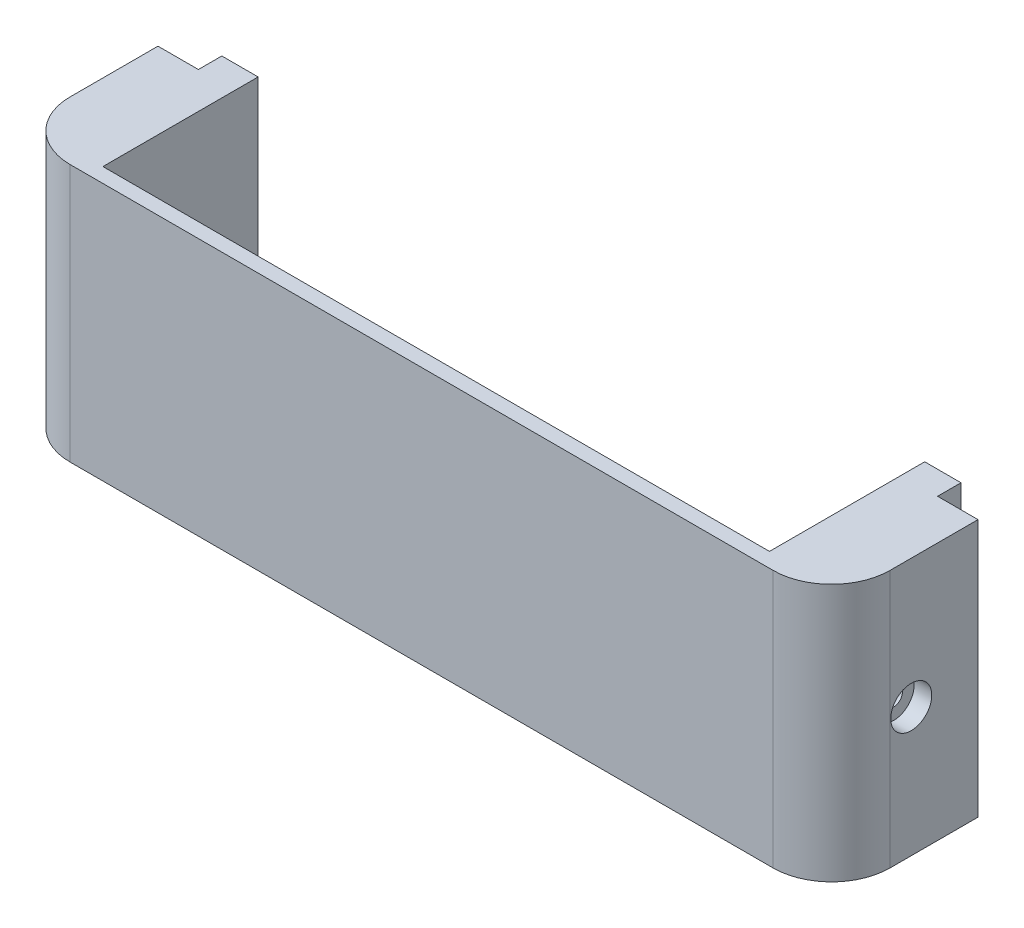
ISO-10303-21;
HEADER;
FILE_DESCRIPTION(('STEP AP214'),'2;1');
FILE_NAME('part.step','',(''),(''),'','','');
FILE_SCHEMA(('AUTOMOTIVE_DESIGN { 1 0 10303 214 1 1 1 1 }'));
ENDSEC;
DATA;
#1=APPLICATION_CONTEXT('core data for automotive mechanical design processes');
#2=APPLICATION_PROTOCOL_DEFINITION('international standard','automotive_design',2000,#1);
#3=PRODUCT_CONTEXT('',#1,'mechanical');
#4=PRODUCT('Part','Part','',(#3));
#5=PRODUCT_RELATED_PRODUCT_CATEGORY('part','',(#4));
#6=PRODUCT_DEFINITION_FORMATION('','',#4);
#7=PRODUCT_DEFINITION_CONTEXT('part definition',#1,'design');
#8=PRODUCT_DEFINITION('design','',#6,#7);
#9=PRODUCT_DEFINITION_SHAPE('','',#8);
#10=(LENGTH_UNIT() NAMED_UNIT(*) SI_UNIT(.MILLI.,.METRE.));
#11=(NAMED_UNIT(*) PLANE_ANGLE_UNIT() SI_UNIT($,.RADIAN.));
#12=(NAMED_UNIT(*) SI_UNIT($,.STERADIAN.) SOLID_ANGLE_UNIT());
#13=UNCERTAINTY_MEASURE_WITH_UNIT(LENGTH_MEASURE(1.E-05),#10,'distance_accuracy_value','');
#14=(GEOMETRIC_REPRESENTATION_CONTEXT(3) GLOBAL_UNCERTAINTY_ASSIGNED_CONTEXT((#13)) GLOBAL_UNIT_ASSIGNED_CONTEXT((#10,
#11,#12)) REPRESENTATION_CONTEXT('',''));
#15=CARTESIAN_POINT('',(0.,0.,0.));
#16=DIRECTION('',(0.,0.,1.));
#17=DIRECTION('',(1.,0.,0.));
#18=AXIS2_PLACEMENT_3D('',#15,#16,#17);
#19=CARTESIAN_POINT('',(15.,-22.,14.));
#20=DIRECTION('',(0.,-1.,0.));
#21=DIRECTION('',(1.,0.,0.));
#22=AXIS2_PLACEMENT_3D('',#19,#20,#21);
#23=PLANE('',#22);
#24=DIRECTION('',(0.,0.,-1.));
#25=VECTOR('',#24,1.);
#26=CARTESIAN_POINT('',(3.1,-22.,0.));
#27=LINE('',#26,#25);
#28=CARTESIAN_POINT('',(3.1,-22.,26.5));
#29=VERTEX_POINT('',#28);
#30=CARTESIAN_POINT('',(3.1,-22.,0.));
#31=VERTEX_POINT('',#30);
#32=EDGE_CURVE('E116',#29,#31,#27,.T.);
#33=ORIENTED_EDGE('',*,*,#32,.F.);
#34=DIRECTION('',(1.,0.,0.));
#35=VECTOR('',#34,1.);
#36=CARTESIAN_POINT('',(10.,-22.,26.5));
#37=LINE('',#36,#35);
#38=CARTESIAN_POINT('',(116.9,-22.,26.5));
#39=VERTEX_POINT('',#38);
#40=EDGE_CURVE('E217',#29,#39,#37,.T.);
#41=ORIENTED_EDGE('',*,*,#40,.T.);
#42=DIRECTION('',(0.,0.,-1.));
#43=VECTOR('',#42,1.);
#44=CARTESIAN_POINT('',(116.9,-22.,4.));
#45=LINE('',#44,#43);
#46=CARTESIAN_POINT('',(116.9,-22.,0.));
#47=VERTEX_POINT('',#46);
#48=EDGE_CURVE('E268',#39,#47,#45,.T.);
#49=ORIENTED_EDGE('',*,*,#48,.T.);
#50=DIRECTION('',(1.,0.,0.));
#51=VECTOR('',#50,1.);
#52=CARTESIAN_POINT('',(116.9,-22.,0.));
#53=LINE('',#52,#51);
#54=CARTESIAN_POINT('',(123.1,-22.,0.));
#55=VERTEX_POINT('',#54);
#56=EDGE_CURVE('E265',#47,#55,#53,.T.);
#57=ORIENTED_EDGE('',*,*,#56,.T.);
#58=DIRECTION('',(0.,0.,1.));
#59=VECTOR('',#58,1.);
#60=CARTESIAN_POINT('',(123.1,-22.,0.));
#61=LINE('',#60,#59);
#62=CARTESIAN_POINT('',(123.1,-22.,4.));
#63=VERTEX_POINT('',#62);
#64=EDGE_CURVE('E261',#55,#63,#61,.T.);
#65=ORIENTED_EDGE('',*,*,#64,.T.);
#66=DIRECTION('',(1.,0.,0.));
#67=VECTOR('',#66,1.);
#68=CARTESIAN_POINT('',(123.1,-22.,4.));
#69=LINE('',#68,#67);
#70=CARTESIAN_POINT('',(130.,-22.,4.));
#71=VERTEX_POINT('',#70);
#72=EDGE_CURVE('E257',#63,#71,#69,.T.);
#73=ORIENTED_EDGE('',*,*,#72,.T.);
#74=DIRECTION('',(0.,0.,-1.));
#75=VECTOR('',#74,1.);
#76=CARTESIAN_POINT('',(130.,-22.,19.));
#77=LINE('',#76,#75);
#78=CARTESIAN_POINT('',(130.,-22.,19.));
#79=VERTEX_POINT('',#78);
#80=EDGE_CURVE('E225',#79,#71,#77,.T.);
#81=ORIENTED_EDGE('',*,*,#80,.F.);
#82=CARTESIAN_POINT('',(120.,-22.,19.));
#83=DIRECTION('',(0.,-1.,0.));
#84=DIRECTION('',(1.,0.,0.));
#85=AXIS2_PLACEMENT_3D('',#82,#83,#84);
#86=CIRCLE('',#85,10.);
#87=CARTESIAN_POINT('',(120.,-22.,29.));
#88=VERTEX_POINT('',#87);
#89=EDGE_CURVE('E219',#79,#88,#86,.T.);
#90=ORIENTED_EDGE('',*,*,#89,.T.);
#91=DIRECTION('',(1.,0.,0.));
#92=VECTOR('',#91,1.);
#93=CARTESIAN_POINT('',(-10.,-22.,29.));
#94=LINE('',#93,#92);
#95=CARTESIAN_POINT('',(0.,-22.,29.));
#96=VERTEX_POINT('',#95);
#97=EDGE_CURVE('E303',#96,#88,#94,.T.);
#98=ORIENTED_EDGE('',*,*,#97,.F.);
#99=CARTESIAN_POINT('',(0.,-22.,19.));
#100=DIRECTION('',(0.,1.,0.));
#101=DIRECTION('',(-1.,0.,0.));
#102=AXIS2_PLACEMENT_3D('',#99,#100,#101);
#103=CIRCLE('',#102,10.);
#104=CARTESIAN_POINT('',(-10.,-22.,19.));
#105=VERTEX_POINT('',#104);
#106=EDGE_CURVE('E108',#105,#96,#103,.T.);
#107=ORIENTED_EDGE('',*,*,#106,.F.);
#108=DIRECTION('',(0.,0.,1.));
#109=VECTOR('',#108,1.);
#110=CARTESIAN_POINT('',(-10.,-22.,0.));
#111=LINE('',#110,#109);
#112=CARTESIAN_POINT('',(-10.,-22.,4.));
#113=VERTEX_POINT('',#112);
#114=EDGE_CURVE('E309',#113,#105,#111,.T.);
#115=ORIENTED_EDGE('',*,*,#114,.F.);
#116=DIRECTION('',(-1.,0.,0.));
#117=VECTOR('',#116,1.);
#118=CARTESIAN_POINT('',(0.,-22.,4.));
#119=LINE('',#118,#117);
#120=CARTESIAN_POINT('',(-3.1,-22.,4.));
#121=VERTEX_POINT('',#120);
#122=EDGE_CURVE('E321',#121,#113,#119,.T.);
#123=ORIENTED_EDGE('',*,*,#122,.F.);
#124=DIRECTION('',(0.,0.,1.));
#125=VECTOR('',#124,1.);
#126=CARTESIAN_POINT('',(-3.1,-22.,0.));
#127=LINE('',#126,#125);
#128=CARTESIAN_POINT('',(-3.1,-22.,0.));
#129=VERTEX_POINT('',#128);
#130=EDGE_CURVE('E318',#129,#121,#127,.T.);
#131=ORIENTED_EDGE('',*,*,#130,.F.);
#132=DIRECTION('',(-1.,0.,0.));
#133=VECTOR('',#132,1.);
#134=CARTESIAN_POINT('',(15.,-22.,0.));
#135=LINE('',#134,#133);
#136=EDGE_CURVE('E101',#31,#129,#135,.T.);
#137=ORIENTED_EDGE('',*,*,#136,.F.);
#138=EDGE_LOOP('',(#33,#41,#49,#57,#65,#73,#81,#90,#98,#107,#115,#123,#131,#137));
#139=FACE_BOUND('',#138,.T.);
#140=ADVANCED_FACE('F92',(#139),#23,.T.);
#141=CARTESIAN_POINT('',(0.,22.,14.));
#142=DIRECTION('',(0.,1.,0.));
#143=DIRECTION('',(0.,0.,1.));
#144=AXIS2_PLACEMENT_3D('',#141,#142,#143);
#145=PLANE('',#144);
#146=DIRECTION('',(1.,0.,0.));
#147=VECTOR('',#146,1.);
#148=CARTESIAN_POINT('',(9.99999999999999,22.,26.5));
#149=LINE('',#148,#147);
#150=CARTESIAN_POINT('',(3.1,22.,26.5));
#151=VERTEX_POINT('',#150);
#152=CARTESIAN_POINT('',(116.9,22.,26.5));
#153=VERTEX_POINT('',#152);
#154=EDGE_CURVE('E204',#151,#153,#149,.T.);
#155=ORIENTED_EDGE('',*,*,#154,.F.);
#156=DIRECTION('',(0.,0.,-1.));
#157=VECTOR('',#156,1.);
#158=CARTESIAN_POINT('',(3.1,22.,0.));
#159=LINE('',#158,#157);
#160=CARTESIAN_POINT('',(3.1,22.,0.));
#161=VERTEX_POINT('',#160);
#162=EDGE_CURVE('E192',#151,#161,#159,.T.);
#163=ORIENTED_EDGE('',*,*,#162,.T.);
#164=DIRECTION('',(1.,0.,0.));
#165=VECTOR('',#164,1.);
#166=CARTESIAN_POINT('',(0.,22.,0.));
#167=LINE('',#166,#165);
#168=CARTESIAN_POINT('',(-3.1,22.,0.));
#169=VERTEX_POINT('',#168);
#170=EDGE_CURVE('E12',#169,#161,#167,.T.);
#171=ORIENTED_EDGE('',*,*,#170,.F.);
#172=DIRECTION('',(0.,0.,1.));
#173=VECTOR('',#172,1.);
#174=CARTESIAN_POINT('',(-3.1,22.,0.));
#175=LINE('',#174,#173);
#176=CARTESIAN_POINT('',(-3.1,22.,4.));
#177=VERTEX_POINT('',#176);
#178=EDGE_CURVE('E201',#169,#177,#175,.T.);
#179=ORIENTED_EDGE('',*,*,#178,.T.);
#180=DIRECTION('',(-1.,0.,0.));
#181=VECTOR('',#180,1.);
#182=CARTESIAN_POINT('',(0.,22.,4.));
#183=LINE('',#182,#181);
#184=CARTESIAN_POINT('',(-10.,22.,4.));
#185=VERTEX_POINT('',#184);
#186=EDGE_CURVE('E322',#177,#185,#183,.T.);
#187=ORIENTED_EDGE('',*,*,#186,.T.);
#188=DIRECTION('',(0.,0.,-1.));
#189=VECTOR('',#188,1.);
#190=CARTESIAN_POINT('',(-10.,22.,14.));
#191=LINE('',#190,#189);
#192=CARTESIAN_POINT('',(-10.,22.,19.));
#193=VERTEX_POINT('',#192);
#194=EDGE_CURVE('E315',#193,#185,#191,.T.);
#195=ORIENTED_EDGE('',*,*,#194,.F.);
#196=CARTESIAN_POINT('',(0.,22.,19.));
#197=DIRECTION('',(0.,1.,0.));
#198=DIRECTION('',(-1.,0.,0.));
#199=AXIS2_PLACEMENT_3D('',#196,#197,#198);
#200=CIRCLE('',#199,10.);
#201=CARTESIAN_POINT('',(0.,22.,29.));
#202=VERTEX_POINT('',#201);
#203=EDGE_CURVE('E293',#193,#202,#200,.T.);
#204=ORIENTED_EDGE('',*,*,#203,.T.);
#205=DIRECTION('',(1.,0.,0.));
#206=VECTOR('',#205,1.);
#207=CARTESIAN_POINT('',(-10.,22.,29.));
#208=LINE('',#207,#206);
#209=CARTESIAN_POINT('',(120.,22.,29.));
#210=VERTEX_POINT('',#209);
#211=EDGE_CURVE('E306',#202,#210,#208,.T.);
#212=ORIENTED_EDGE('',*,*,#211,.T.);
#213=CARTESIAN_POINT('',(120.,22.,19.));
#214=DIRECTION('',(0.,-1.,0.));
#215=DIRECTION('',(1.,0.,0.));
#216=AXIS2_PLACEMENT_3D('',#213,#214,#215);
#217=CIRCLE('',#216,10.);
#218=CARTESIAN_POINT('',(130.,22.,19.));
#219=VERTEX_POINT('',#218);
#220=EDGE_CURVE('E233',#219,#210,#217,.T.);
#221=ORIENTED_EDGE('',*,*,#220,.F.);
#222=DIRECTION('',(0.,0.,-1.));
#223=VECTOR('',#222,1.);
#224=CARTESIAN_POINT('',(130.,22.,19.));
#225=LINE('',#224,#223);
#226=CARTESIAN_POINT('',(130.,22.,4.));
#227=VERTEX_POINT('',#226);
#228=EDGE_CURVE('E237',#219,#227,#225,.T.);
#229=ORIENTED_EDGE('',*,*,#228,.T.);
#230=DIRECTION('',(1.,0.,0.));
#231=VECTOR('',#230,1.);
#232=CARTESIAN_POINT('',(123.1,22.,4.));
#233=LINE('',#232,#231);
#234=CARTESIAN_POINT('',(123.1,22.,4.));
#235=VERTEX_POINT('',#234);
#236=EDGE_CURVE('E240',#235,#227,#233,.T.);
#237=ORIENTED_EDGE('',*,*,#236,.F.);
#238=DIRECTION('',(0.,0.,1.));
#239=VECTOR('',#238,1.);
#240=CARTESIAN_POINT('',(123.1,22.,0.));
#241=LINE('',#240,#239);
#242=CARTESIAN_POINT('',(123.1,22.,0.));
#243=VERTEX_POINT('',#242);
#244=EDGE_CURVE('E244',#243,#235,#241,.T.);
#245=ORIENTED_EDGE('',*,*,#244,.F.);
#246=DIRECTION('',(1.,0.,0.));
#247=VECTOR('',#246,1.);
#248=CARTESIAN_POINT('',(120.,22.,0.));
#249=LINE('',#248,#247);
#250=CARTESIAN_POINT('',(116.9,22.,0.));
#251=VERTEX_POINT('',#250);
#252=EDGE_CURVE('E248',#251,#243,#249,.T.);
#253=ORIENTED_EDGE('',*,*,#252,.F.);
#254=DIRECTION('',(0.,0.,-1.));
#255=VECTOR('',#254,1.);
#256=CARTESIAN_POINT('',(116.9,22.,4.));
#257=LINE('',#256,#255);
#258=EDGE_CURVE('E207',#153,#251,#257,.T.);
#259=ORIENTED_EDGE('',*,*,#258,.F.);
#260=EDGE_LOOP('',(#155,#163,#171,#179,#187,#195,#204,#212,#221,#229,#237,#245,#253,#259));
#261=FACE_BOUND('',#260,.T.);
#262=ADVANCED_FACE('F205',(#261),#145,.T.);
#263=CARTESIAN_POINT('',(-10.,22.,29.));
#264=DIRECTION('',(0.,0.,-1.));
#265=DIRECTION('',(-1.,0.,0.));
#266=AXIS2_PLACEMENT_3D('',#263,#264,#265);
#267=PLANE('',#266);
#268=DIRECTION('',(0.,-1.,0.));
#269=VECTOR('',#268,1.);
#270=CARTESIAN_POINT('',(0.,22.,29.));
#271=LINE('',#270,#269);
#272=EDGE_CURVE('E300',#202,#96,#271,.T.);
#273=ORIENTED_EDGE('',*,*,#272,.T.);
#274=ORIENTED_EDGE('',*,*,#97,.T.);
#275=DIRECTION('',(0.,-1.,0.));
#276=VECTOR('',#275,1.);
#277=CARTESIAN_POINT('',(120.,22.,29.));
#278=LINE('',#277,#276);
#279=EDGE_CURVE('E289',#210,#88,#278,.T.);
#280=ORIENTED_EDGE('',*,*,#279,.F.);
#281=ORIENTED_EDGE('',*,*,#211,.F.);
#282=EDGE_LOOP('',(#273,#274,#280,#281));
#283=FACE_BOUND('',#282,.T.);
#284=ADVANCED_FACE('F373',(#283),#267,.F.);
#285=CARTESIAN_POINT('',(0.,-22.,4.));
#286=DIRECTION('',(0.,0.,-1.));
#287=DIRECTION('',(-1.,0.,0.));
#288=AXIS2_PLACEMENT_3D('',#285,#286,#287);
#289=PLANE('',#288);
#290=ORIENTED_EDGE('',*,*,#186,.F.);
#291=DIRECTION('',(0.,1.,0.));
#292=VECTOR('',#291,1.);
#293=CARTESIAN_POINT('',(-3.1,-22.,4.));
#294=LINE('',#293,#292);
#295=EDGE_CURVE('E333',#121,#177,#294,.T.);
#296=ORIENTED_EDGE('',*,*,#295,.F.);
#297=ORIENTED_EDGE('',*,*,#122,.T.);
#298=DIRECTION('',(0.,1.,0.));
#299=VECTOR('',#298,1.);
#300=CARTESIAN_POINT('',(-10.,-22.,4.));
#301=LINE('',#300,#299);
#302=EDGE_CURVE('E336',#113,#185,#301,.T.);
#303=ORIENTED_EDGE('',*,*,#302,.T.);
#304=EDGE_LOOP('',(#290,#296,#297,#303));
#305=FACE_BOUND('',#304,.T.);
#306=ADVANCED_FACE('F361',(#305),#289,.T.);
#307=CARTESIAN_POINT('',(0.,0.,0.));
#308=DIRECTION('',(0.,0.,1.));
#309=DIRECTION('',(1.,0.,0.));
#310=AXIS2_PLACEMENT_3D('',#307,#308,#309);
#311=PLANE('',#310);
#312=DIRECTION('',(0.,1.,0.));
#313=VECTOR('',#312,1.);
#314=CARTESIAN_POINT('',(-3.1,-22.,0.));
#315=LINE('',#314,#313);
#316=EDGE_CURVE('E326',#129,#169,#315,.T.);
#317=ORIENTED_EDGE('',*,*,#316,.T.);
#318=ORIENTED_EDGE('',*,*,#170,.T.);
#319=DIRECTION('',(0.,1.,0.));
#320=VECTOR('',#319,1.);
#321=CARTESIAN_POINT('',(3.1,-22.,0.));
#322=LINE('',#321,#320);
#323=EDGE_CURVE('E197',#31,#161,#322,.T.);
#324=ORIENTED_EDGE('',*,*,#323,.F.);
#325=ORIENTED_EDGE('',*,*,#136,.T.);
#326=EDGE_LOOP('',(#317,#318,#324,#325));
#327=FACE_BOUND('',#326,.T.);
#328=ADVANCED_FACE('F350',(#327),#311,.F.);
#329=CARTESIAN_POINT('',(3.1,-22.,0.));
#330=DIRECTION('',(1.,0.,0.));
#331=DIRECTION('',(0.,0.,-1.));
#332=AXIS2_PLACEMENT_3D('',#329,#330,#331);
#333=PLANE('',#332);
#334=CARTESIAN_POINT('',(3.09999999999999,0.,15.4));
#335=DIRECTION('',(1.,0.,0.));
#336=DIRECTION('',(0.,0.,-1.));
#337=AXIS2_PLACEMENT_3D('',#334,#335,#336);
#338=CIRCLE('',#337,1.51);
#339=CARTESIAN_POINT('',(3.09999999999999,0.,13.89));
#340=VERTEX_POINT('',#339);
#341=EDGE_CURVE('E558',#340,#340,#338,.T.);
#342=ORIENTED_EDGE('',*,*,#341,.F.);
#343=EDGE_LOOP('',(#342));
#344=FACE_BOUND('',#343,.T.);
#345=ORIENTED_EDGE('',*,*,#323,.T.);
#346=ORIENTED_EDGE('',*,*,#162,.F.);
#347=DIRECTION('',(0.,1.,0.));
#348=VECTOR('',#347,1.);
#349=CARTESIAN_POINT('',(3.1,-28.,26.5));
#350=LINE('',#349,#348);
#351=EDGE_CURVE('E196',#29,#151,#350,.T.);
#352=ORIENTED_EDGE('',*,*,#351,.F.);
#353=ORIENTED_EDGE('',*,*,#32,.T.);
#354=EDGE_LOOP('',(#345,#346,#352,#353));
#355=FACE_BOUND('',#354,.T.);
#356=ADVANCED_FACE('F194',(#344,#355),#333,.T.);
#357=CARTESIAN_POINT('',(-3.1,-22.,0.));
#358=DIRECTION('',(-1.,0.,0.));
#359=DIRECTION('',(0.,0.,1.));
#360=AXIS2_PLACEMENT_3D('',#357,#358,#359);
#361=PLANE('',#360);
#362=ORIENTED_EDGE('',*,*,#295,.T.);
#363=ORIENTED_EDGE('',*,*,#178,.F.);
#364=ORIENTED_EDGE('',*,*,#316,.F.);
#365=ORIENTED_EDGE('',*,*,#130,.T.);
#366=EDGE_LOOP('',(#362,#363,#364,#365));
#367=FACE_BOUND('',#366,.T.);
#368=ADVANCED_FACE('F358',(#367),#361,.T.);
#369=CARTESIAN_POINT('',(-10.,28.,0.));
#370=DIRECTION('',(1.,0.,0.));
#371=DIRECTION('',(0.,1.,0.));
#372=AXIS2_PLACEMENT_3D('',#369,#370,#371);
#373=PLANE('',#372);
#374=CARTESIAN_POINT('',(-10.,0.,15.4));
#375=DIRECTION('',(-1.,0.,0.));
#376=DIRECTION('',(0.,-1.,0.));
#377=AXIS2_PLACEMENT_3D('',#374,#375,#376);
#378=CIRCLE('',#377,3.5);
#379=CARTESIAN_POINT('',(-10.,-3.5,15.4));
#380=VERTEX_POINT('',#379);
#381=EDGE_CURVE('E573',#380,#380,#378,.T.);
#382=ORIENTED_EDGE('',*,*,#381,.F.);
#383=EDGE_LOOP('',(#382));
#384=FACE_BOUND('',#383,.T.);
#385=ORIENTED_EDGE('',*,*,#114,.T.);
#386=DIRECTION('',(0.,-1.,0.));
#387=VECTOR('',#386,1.);
#388=CARTESIAN_POINT('',(-10.,22.,19.));
#389=LINE('',#388,#387);
#390=EDGE_CURVE('E297',#193,#105,#389,.T.);
#391=ORIENTED_EDGE('',*,*,#390,.F.);
#392=ORIENTED_EDGE('',*,*,#194,.T.);
#393=ORIENTED_EDGE('',*,*,#302,.F.);
#394=EDGE_LOOP('',(#385,#391,#392,#393));
#395=FACE_BOUND('',#394,.T.);
#396=ADVANCED_FACE('F366',(#384,#395),#373,.F.);
#397=CARTESIAN_POINT('',(0.,22.,19.));
#398=DIRECTION('',(0.,-1.,0.));
#399=DIRECTION('',(1.,0.,0.));
#400=AXIS2_PLACEMENT_3D('',#397,#398,#399);
#401=CYLINDRICAL_SURFACE('',#400,10.);
#402=ORIENTED_EDGE('',*,*,#106,.T.);
#403=ORIENTED_EDGE('',*,*,#272,.F.);
#404=ORIENTED_EDGE('',*,*,#203,.F.);
#405=ORIENTED_EDGE('',*,*,#390,.T.);
#406=EDGE_LOOP('',(#402,#403,#404,#405));
#407=FACE_BOUND('',#406,.T.);
#408=ADVANCED_FACE('F367',(#407),#401,.T.);
#409=CARTESIAN_POINT('',(120.,22.,19.));
#410=DIRECTION('',(0.,-1.,0.));
#411=DIRECTION('',(1.,0.,0.));
#412=AXIS2_PLACEMENT_3D('',#409,#410,#411);
#413=CYLINDRICAL_SURFACE('',#412,10.);
#414=ORIENTED_EDGE('',*,*,#89,.F.);
#415=DIRECTION('',(0.,-1.,0.));
#416=VECTOR('',#415,1.);
#417=CARTESIAN_POINT('',(130.,22.,19.));
#418=LINE('',#417,#416);
#419=EDGE_CURVE('E286',#219,#79,#418,.T.);
#420=ORIENTED_EDGE('',*,*,#419,.F.);
#421=ORIENTED_EDGE('',*,*,#220,.T.);
#422=ORIENTED_EDGE('',*,*,#279,.T.);
#423=EDGE_LOOP('',(#414,#420,#421,#422));
#424=FACE_BOUND('',#423,.T.);
#425=ADVANCED_FACE('F375',(#424),#413,.T.);
#426=CARTESIAN_POINT('',(130.,22.,19.));
#427=DIRECTION('',(-1.,0.,0.));
#428=DIRECTION('',(0.,-1.,0.));
#429=AXIS2_PLACEMENT_3D('',#426,#427,#428);
#430=PLANE('',#429);
#431=CARTESIAN_POINT('',(130.,0.,15.4));
#432=DIRECTION('',(1.,0.,0.));
#433=DIRECTION('',(0.,0.,-1.));
#434=AXIS2_PLACEMENT_3D('',#431,#432,#433);
#435=CIRCLE('',#434,3.5);
#436=CARTESIAN_POINT('',(130.,0.,11.9));
#437=VERTEX_POINT('',#436);
#438=EDGE_CURVE('E230',#437,#437,#435,.T.);
#439=ORIENTED_EDGE('',*,*,#438,.F.);
#440=EDGE_LOOP('',(#439));
#441=FACE_BOUND('',#440,.T.);
#442=ORIENTED_EDGE('',*,*,#80,.T.);
#443=DIRECTION('',(0.,-1.,0.));
#444=VECTOR('',#443,1.);
#445=CARTESIAN_POINT('',(130.,22.,4.));
#446=LINE('',#445,#444);
#447=EDGE_CURVE('E283',#227,#71,#446,.T.);
#448=ORIENTED_EDGE('',*,*,#447,.F.);
#449=ORIENTED_EDGE('',*,*,#228,.F.);
#450=ORIENTED_EDGE('',*,*,#419,.T.);
#451=EDGE_LOOP('',(#442,#448,#449,#450));
#452=FACE_BOUND('',#451,.T.);
#453=ADVANCED_FACE('F382',(#441,#452),#430,.F.);
#454=CARTESIAN_POINT('',(123.1,22.,4.));
#455=DIRECTION('',(0.,0.,-1.));
#456=DIRECTION('',(-1.,0.,0.));
#457=AXIS2_PLACEMENT_3D('',#454,#455,#456);
#458=PLANE('',#457);
#459=ORIENTED_EDGE('',*,*,#72,.F.);
#460=DIRECTION('',(0.,-1.,0.));
#461=VECTOR('',#460,1.);
#462=CARTESIAN_POINT('',(123.1,22.,4.));
#463=LINE('',#462,#461);
#464=EDGE_CURVE('E280',#235,#63,#463,.T.);
#465=ORIENTED_EDGE('',*,*,#464,.F.);
#466=ORIENTED_EDGE('',*,*,#236,.T.);
#467=ORIENTED_EDGE('',*,*,#447,.T.);
#468=EDGE_LOOP('',(#459,#465,#466,#467));
#469=FACE_BOUND('',#468,.T.);
#470=ADVANCED_FACE('F385',(#469),#458,.T.);
#471=CARTESIAN_POINT('',(123.1,22.,0.));
#472=DIRECTION('',(1.,0.,0.));
#473=DIRECTION('',(0.,1.,0.));
#474=AXIS2_PLACEMENT_3D('',#471,#472,#473);
#475=PLANE('',#474);
#476=ORIENTED_EDGE('',*,*,#64,.F.);
#477=DIRECTION('',(0.,-1.,0.));
#478=VECTOR('',#477,1.);
#479=CARTESIAN_POINT('',(123.1,22.,0.));
#480=LINE('',#479,#478);
#481=EDGE_CURVE('E276',#243,#55,#480,.T.);
#482=ORIENTED_EDGE('',*,*,#481,.F.);
#483=ORIENTED_EDGE('',*,*,#244,.T.);
#484=ORIENTED_EDGE('',*,*,#464,.T.);
#485=EDGE_LOOP('',(#476,#482,#483,#484));
#486=FACE_BOUND('',#485,.T.);
#487=ADVANCED_FACE('F388',(#486),#475,.T.);
#488=CARTESIAN_POINT('',(116.9,22.,0.));
#489=DIRECTION('',(0.,0.,-1.));
#490=DIRECTION('',(-1.,0.,0.));
#491=AXIS2_PLACEMENT_3D('',#488,#489,#490);
#492=PLANE('',#491);
#493=ORIENTED_EDGE('',*,*,#56,.F.);
#494=DIRECTION('',(0.,-1.,0.));
#495=VECTOR('',#494,1.);
#496=CARTESIAN_POINT('',(116.9,22.,0.));
#497=LINE('',#496,#495);
#498=EDGE_CURVE('E212',#251,#47,#497,.T.);
#499=ORIENTED_EDGE('',*,*,#498,.F.);
#500=ORIENTED_EDGE('',*,*,#252,.T.);
#501=ORIENTED_EDGE('',*,*,#481,.T.);
#502=EDGE_LOOP('',(#493,#499,#500,#501));
#503=FACE_BOUND('',#502,.T.);
#504=ADVANCED_FACE('F392',(#503),#492,.T.);
#505=CARTESIAN_POINT('',(116.9,22.,4.));
#506=DIRECTION('',(-1.,0.,0.));
#507=DIRECTION('',(0.,-1.,0.));
#508=AXIS2_PLACEMENT_3D('',#505,#506,#507);
#509=PLANE('',#508);
#510=CARTESIAN_POINT('',(116.9,0.,15.4));
#511=DIRECTION('',(-1.,0.,0.));
#512=DIRECTION('',(0.,-1.,0.));
#513=AXIS2_PLACEMENT_3D('',#510,#511,#512);
#514=CIRCLE('',#513,1.51);
#515=CARTESIAN_POINT('',(116.9,-1.50999999999999,15.4));
#516=VERTEX_POINT('',#515);
#517=EDGE_CURVE('E566',#516,#516,#514,.T.);
#518=ORIENTED_EDGE('',*,*,#517,.F.);
#519=EDGE_LOOP('',(#518));
#520=FACE_BOUND('',#519,.T.);
#521=ORIENTED_EDGE('',*,*,#48,.F.);
#522=DIRECTION('',(0.,1.,0.));
#523=VECTOR('',#522,1.);
#524=CARTESIAN_POINT('',(116.9,-28.,26.5));
#525=LINE('',#524,#523);
#526=EDGE_CURVE('E220',#39,#153,#525,.T.);
#527=ORIENTED_EDGE('',*,*,#526,.T.);
#528=ORIENTED_EDGE('',*,*,#258,.T.);
#529=ORIENTED_EDGE('',*,*,#498,.T.);
#530=EDGE_LOOP('',(#521,#527,#528,#529));
#531=FACE_BOUND('',#530,.T.);
#532=ADVANCED_FACE('F394',(#520,#531),#509,.T.);
#533=CARTESIAN_POINT('',(9.99999999999999,22.,26.5));
#534=DIRECTION('',(0.,0.,-1.));
#535=DIRECTION('',(-1.,0.,0.));
#536=AXIS2_PLACEMENT_3D('',#533,#534,#535);
#537=PLANE('',#536);
#538=ORIENTED_EDGE('',*,*,#40,.F.);
#539=ORIENTED_EDGE('',*,*,#351,.T.);
#540=ORIENTED_EDGE('',*,*,#154,.T.);
#541=ORIENTED_EDGE('',*,*,#526,.F.);
#542=EDGE_LOOP('',(#538,#539,#540,#541));
#543=FACE_BOUND('',#542,.T.);
#544=ADVANCED_FACE('F215',(#543),#537,.T.);
#545=CARTESIAN_POINT('',(127.,0.,15.4));
#546=DIRECTION('',(1.,0.,0.));
#547=DIRECTION('',(0.,1.,0.));
#548=AXIS2_PLACEMENT_3D('',#545,#546,#547);
#549=CYLINDRICAL_SURFACE('',#548,3.5);
#550=CARTESIAN_POINT('',(127.,0.,15.4));
#551=DIRECTION('',(1.,0.,0.));
#552=DIRECTION('',(0.,0.,-1.));
#553=AXIS2_PLACEMENT_3D('',#550,#551,#552);
#554=CIRCLE('',#553,3.5);
#555=CARTESIAN_POINT('',(127.,0.,11.9));
#556=VERTEX_POINT('',#555);
#557=EDGE_CURVE('E227',#556,#556,#554,.T.);
#558=ORIENTED_EDGE('',*,*,#557,.F.);
#559=EDGE_LOOP('',(#558));
#560=FACE_BOUND('',#559,.T.);
#561=ORIENTED_EDGE('',*,*,#438,.T.);
#562=EDGE_LOOP('',(#561));
#563=FACE_BOUND('',#562,.T.);
#564=ADVANCED_FACE('F402',(#560,#563),#549,.F.);
#565=CARTESIAN_POINT('',(127.,0.,0.));
#566=DIRECTION('',(1.,0.,0.));
#567=DIRECTION('',(0.,0.,-1.));
#568=AXIS2_PLACEMENT_3D('',#565,#566,#567);
#569=PLANE('',#568);
#570=CARTESIAN_POINT('',(127.,0.,15.4));
#571=DIRECTION('',(1.,0.,0.));
#572=DIRECTION('',(0.,0.,-1.));
#573=AXIS2_PLACEMENT_3D('',#570,#571,#572);
#574=CIRCLE('',#573,1.51);
#575=CARTESIAN_POINT('',(127.,0.,13.89));
#576=VERTEX_POINT('',#575);
#577=EDGE_CURVE('E95',#576,#576,#574,.T.);
#578=ORIENTED_EDGE('',*,*,#577,.F.);
#579=EDGE_LOOP('',(#578));
#580=FACE_BOUND('',#579,.T.);
#581=ORIENTED_EDGE('',*,*,#557,.T.);
#582=EDGE_LOOP('',(#581));
#583=FACE_BOUND('',#582,.T.);
#584=ADVANCED_FACE('F484',(#580,#583),#569,.T.);
#585=CARTESIAN_POINT('',(-7.,0.,15.4));
#586=DIRECTION('',(-1.,0.,0.));
#587=DIRECTION('',(0.,-1.,0.));
#588=AXIS2_PLACEMENT_3D('',#585,#586,#587);
#589=CYLINDRICAL_SURFACE('',#588,3.5);
#590=CARTESIAN_POINT('',(-7.,0.,15.4));
#591=DIRECTION('',(-1.,0.,0.));
#592=DIRECTION('',(0.,-1.,0.));
#593=AXIS2_PLACEMENT_3D('',#590,#591,#592);
#594=CIRCLE('',#593,3.5);
#595=CARTESIAN_POINT('',(-7.,-3.5,15.4));
#596=VERTEX_POINT('',#595);
#597=EDGE_CURVE('E574',#596,#596,#594,.T.);
#598=ORIENTED_EDGE('',*,*,#597,.F.);
#599=EDGE_LOOP('',(#598));
#600=FACE_BOUND('',#599,.T.);
#601=ORIENTED_EDGE('',*,*,#381,.T.);
#602=EDGE_LOOP('',(#601));
#603=FACE_BOUND('',#602,.T.);
#604=ADVANCED_FACE('F500',(#600,#603),#589,.F.);
#605=CARTESIAN_POINT('',(-7.,0.,15.4));
#606=DIRECTION('',(-1.,0.,0.));
#607=DIRECTION('',(0.,-1.,0.));
#608=AXIS2_PLACEMENT_3D('',#605,#606,#607);
#609=PLANE('',#608);
#610=CARTESIAN_POINT('',(-7.,0.,15.4));
#611=DIRECTION('',(-1.,0.,0.));
#612=DIRECTION('',(0.,-1.,0.));
#613=AXIS2_PLACEMENT_3D('',#610,#611,#612);
#614=CIRCLE('',#613,1.51);
#615=CARTESIAN_POINT('',(-7.,-1.51,15.4));
#616=VERTEX_POINT('',#615);
#617=EDGE_CURVE('E561',#616,#616,#614,.T.);
#618=ORIENTED_EDGE('',*,*,#617,.F.);
#619=EDGE_LOOP('',(#618));
#620=FACE_BOUND('',#619,.T.);
#621=ORIENTED_EDGE('',*,*,#597,.T.);
#622=EDGE_LOOP('',(#621));
#623=FACE_BOUND('',#622,.T.);
#624=ADVANCED_FACE('F505',(#620,#623),#609,.T.);
#625=CARTESIAN_POINT('',(193.,0.,15.4));
#626=DIRECTION('',(-1.,0.,0.));
#627=DIRECTION('',(0.,-1.,0.));
#628=AXIS2_PLACEMENT_3D('',#625,#626,#627);
#629=CYLINDRICAL_SURFACE('',#628,1.51);
#630=ORIENTED_EDGE('',*,*,#517,.T.);
#631=EDGE_LOOP('',(#630));
#632=FACE_BOUND('',#631,.T.);
#633=ORIENTED_EDGE('',*,*,#577,.T.);
#634=EDGE_LOOP('',(#633));
#635=FACE_BOUND('',#634,.T.);
#636=ADVANCED_FACE('F532',(#632,#635),#629,.F.);
#637=ORIENTED_EDGE('',*,*,#341,.T.);
#638=EDGE_LOOP('',(#637));
#639=FACE_BOUND('',#638,.T.);
#640=ORIENTED_EDGE('',*,*,#617,.T.);
#641=EDGE_LOOP('',(#640));
#642=FACE_BOUND('',#641,.T.);
#643=ADVANCED_FACE('F542',(#639,#642),#629,.F.);
#644=CLOSED_SHELL('',(#140,#262,#284,#306,#328,#356,#368,#396,#408,#425,#453,#470,#487,#504,
#532,#544,#564,#584,#604,#624,#636,#643));
#645=MANIFOLD_SOLID_BREP('B2',#644);
#646=ADVANCED_BREP_SHAPE_REPRESENTATION('',(#18,#645),#14);
#647=SHAPE_DEFINITION_REPRESENTATION(#9,#646);
ENDSEC;
END-ISO-10303-21;
